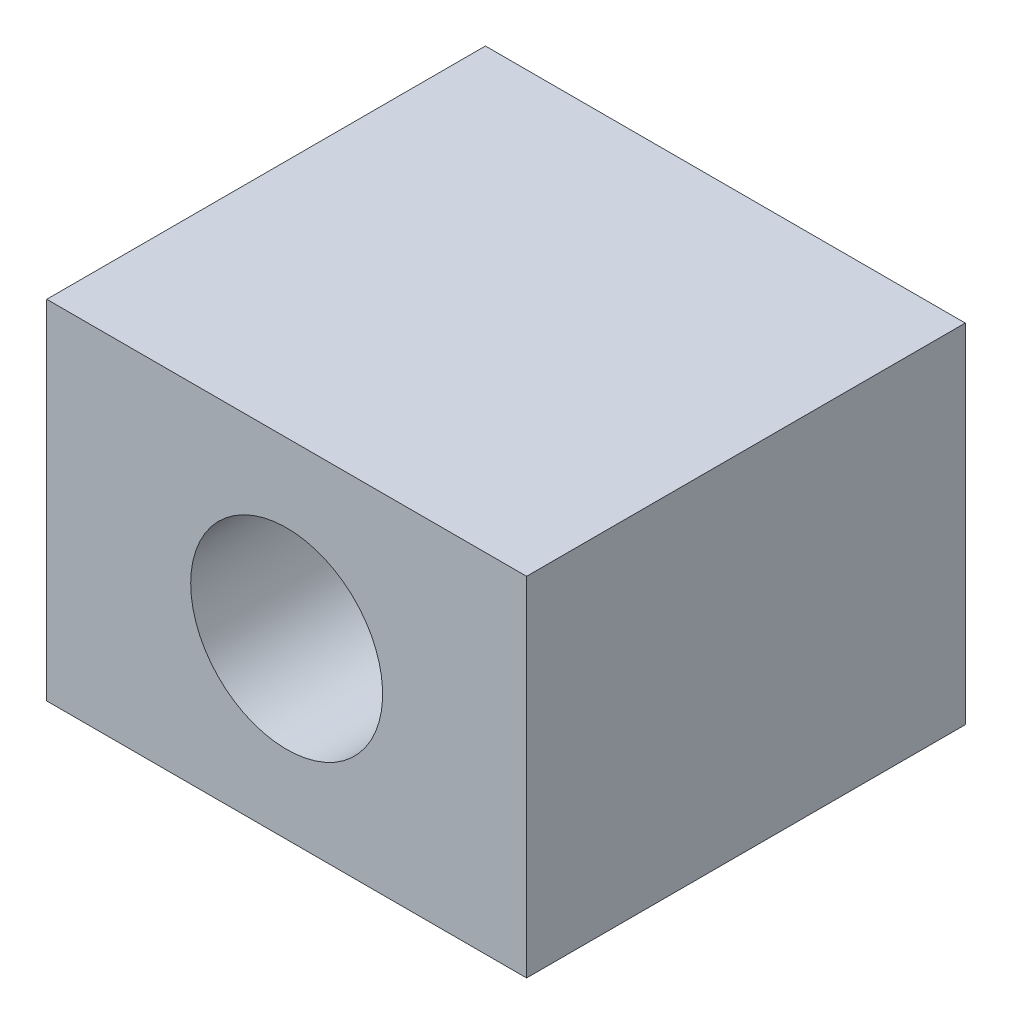
ISO-10303-21;
HEADER;
FILE_DESCRIPTION(('STEP AP214'),'2;1');
FILE_NAME('part.step','',(''),(''),'','','');
FILE_SCHEMA(('AUTOMOTIVE_DESIGN { 1 0 10303 214 1 1 1 1 }'));
ENDSEC;
DATA;
#1=APPLICATION_CONTEXT('core data for automotive mechanical design processes');
#2=APPLICATION_PROTOCOL_DEFINITION('international standard','automotive_design',2000,#1);
#3=PRODUCT_CONTEXT('',#1,'mechanical');
#4=PRODUCT('Part','Part','',(#3));
#5=PRODUCT_RELATED_PRODUCT_CATEGORY('part','',(#4));
#6=PRODUCT_DEFINITION_FORMATION('','',#4);
#7=PRODUCT_DEFINITION_CONTEXT('part definition',#1,'design');
#8=PRODUCT_DEFINITION('design','',#6,#7);
#9=PRODUCT_DEFINITION_SHAPE('','',#8);
#10=(LENGTH_UNIT() NAMED_UNIT(*) SI_UNIT(.MILLI.,.METRE.));
#11=(NAMED_UNIT(*) PLANE_ANGLE_UNIT() SI_UNIT($,.RADIAN.));
#12=(NAMED_UNIT(*) SI_UNIT($,.STERADIAN.) SOLID_ANGLE_UNIT());
#13=UNCERTAINTY_MEASURE_WITH_UNIT(LENGTH_MEASURE(1.E-05),#10,'distance_accuracy_value','');
#14=(GEOMETRIC_REPRESENTATION_CONTEXT(3) GLOBAL_UNCERTAINTY_ASSIGNED_CONTEXT((#13)) GLOBAL_UNIT_ASSIGNED_CONTEXT((#10,
#11,#12)) REPRESENTATION_CONTEXT('',''));
#15=CARTESIAN_POINT('',(0.,0.,0.));
#16=DIRECTION('',(0.,0.,1.));
#17=DIRECTION('',(1.,0.,0.));
#18=AXIS2_PLACEMENT_3D('',#15,#16,#17);
#19=CARTESIAN_POINT('',(2.,11.,-15.));
#20=DIRECTION('',(0.,1.,0.));
#21=DIRECTION('',(0.,0.,1.));
#22=AXIS2_PLACEMENT_3D('',#19,#20,#21);
#23=PLANE('',#22);
#24=DIRECTION('',(1.,0.,0.));
#25=VECTOR('',#24,1.);
#26=CARTESIAN_POINT('',(-2.,11.,-2.));
#27=LINE('',#26,#25);
#28=CARTESIAN_POINT('',(-2.,11.,-2.));
#29=VERTEX_POINT('',#28);
#30=CARTESIAN_POINT('',(2.,11.,-2.));
#31=VERTEX_POINT('',#30);
#32=EDGE_CURVE('E81',#29,#31,#27,.T.);
#33=ORIENTED_EDGE('',*,*,#32,.T.);
#34=DIRECTION('',(0.,0.,1.));
#35=VECTOR('',#34,1.);
#36=CARTESIAN_POINT('',(2.,11.,-15.));
#37=LINE('',#36,#35);
#38=CARTESIAN_POINT('',(2.,11.,-5.65685424949238));
#39=VERTEX_POINT('',#38);
#40=EDGE_CURVE('E120',#39,#31,#37,.T.);
#41=ORIENTED_EDGE('',*,*,#40,.F.);
#42=DIRECTION('',(1.,0.,0.));
#43=VECTOR('',#42,1.);
#44=CARTESIAN_POINT('',(-2.,11.,-5.65685424949238));
#45=LINE('',#44,#43);
#46=CARTESIAN_POINT('',(-2.,11.,-5.65685424949238));
#47=VERTEX_POINT('',#46);
#48=EDGE_CURVE('E138',#47,#39,#45,.T.);
#49=ORIENTED_EDGE('',*,*,#48,.F.);
#50=DIRECTION('',(0.,0.,1.));
#51=VECTOR('',#50,1.);
#52=CARTESIAN_POINT('',(-2.,11.,-15.));
#53=LINE('',#52,#51);
#54=EDGE_CURVE('E122',#47,#29,#53,.T.);
#55=ORIENTED_EDGE('',*,*,#54,.T.);
#56=EDGE_LOOP('',(#33,#41,#49,#55));
#57=FACE_BOUND('',#56,.T.);
#58=ADVANCED_FACE('F65',(#57),#23,.T.);
#59=CARTESIAN_POINT('',(-2.,8.1,-15.));
#60=DIRECTION('',(0.,-1.,0.));
#61=DIRECTION('',(0.,0.,-1.));
#62=AXIS2_PLACEMENT_3D('',#59,#60,#61);
#63=PLANE('',#62);
#64=DIRECTION('',(1.,0.,0.));
#65=VECTOR('',#64,1.);
#66=CARTESIAN_POINT('',(-2.,8.1,-2.));
#67=LINE('',#66,#65);
#68=CARTESIAN_POINT('',(-2.,8.1,-2.));
#69=VERTEX_POINT('',#68);
#70=CARTESIAN_POINT('',(2.,8.1,-2.));
#71=VERTEX_POINT('',#70);
#72=EDGE_CURVE('E108',#69,#71,#67,.T.);
#73=ORIENTED_EDGE('',*,*,#72,.F.);
#74=DIRECTION('',(0.,0.,1.));
#75=VECTOR('',#74,1.);
#76=CARTESIAN_POINT('',(-2.,8.1,-15.));
#77=LINE('',#76,#75);
#78=CARTESIAN_POINT('',(-2.,8.1,-5.65685424949238));
#79=VERTEX_POINT('',#78);
#80=EDGE_CURVE('E128',#79,#69,#77,.T.);
#81=ORIENTED_EDGE('',*,*,#80,.F.);
#82=DIRECTION('',(1.,0.,0.));
#83=VECTOR('',#82,1.);
#84=CARTESIAN_POINT('',(-2.,8.1,-5.65685424949238));
#85=LINE('',#84,#83);
#86=CARTESIAN_POINT('',(2.,8.1,-5.65685424949238));
#87=VERTEX_POINT('',#86);
#88=EDGE_CURVE('E88',#79,#87,#85,.T.);
#89=ORIENTED_EDGE('',*,*,#88,.T.);
#90=DIRECTION('',(0.,0.,1.));
#91=VECTOR('',#90,1.);
#92=CARTESIAN_POINT('',(2.,8.1,-15.));
#93=LINE('',#92,#91);
#94=EDGE_CURVE('E126',#87,#71,#93,.T.);
#95=ORIENTED_EDGE('',*,*,#94,.T.);
#96=EDGE_LOOP('',(#73,#81,#89,#95));
#97=FACE_BOUND('',#96,.T.);
#98=ADVANCED_FACE('F67',(#97),#63,.T.);
#99=CARTESIAN_POINT('',(0.,9.55,-1.5));
#100=DIRECTION('',(0.,0.,1.));
#101=DIRECTION('',(1.,0.,0.));
#102=AXIS2_PLACEMENT_3D('',#99,#100,#101);
#103=CYLINDRICAL_SURFACE('',#102,0.799999999999999);
#104=CARTESIAN_POINT('',(0.,9.55,-2.));
#105=DIRECTION('',(0.,0.,-1.));
#106=DIRECTION('',(-1.,0.,0.));
#107=AXIS2_PLACEMENT_3D('',#104,#105,#106);
#108=CIRCLE('',#107,0.799999999999999);
#109=CARTESIAN_POINT('',(-0.799999999999999,9.55,-2.));
#110=VERTEX_POINT('',#109);
#111=EDGE_CURVE('E113',#110,#110,#108,.F.);
#112=ORIENTED_EDGE('',*,*,#111,.T.);
#113=EDGE_LOOP('',(#112));
#114=FACE_BOUND('',#113,.T.);
#115=CARTESIAN_POINT('',(0.,9.55,-5.65685424949238));
#116=DIRECTION('',(0.,0.,-1.));
#117=DIRECTION('',(-1.,0.,0.));
#118=AXIS2_PLACEMENT_3D('',#115,#116,#117);
#119=CIRCLE('',#118,0.799999999999999);
#120=CARTESIAN_POINT('',(-0.799999999999999,9.55,-5.65685424949238));
#121=VERTEX_POINT('',#120);
#122=EDGE_CURVE('E69',#121,#121,#119,.F.);
#123=ORIENTED_EDGE('',*,*,#122,.F.);
#124=EDGE_LOOP('',(#123));
#125=FACE_BOUND('',#124,.T.);
#126=ADVANCED_FACE('F145',(#114,#125),#103,.F.);
#127=CARTESIAN_POINT('',(2.,8.1,-15.));
#128=DIRECTION('',(1.,0.,0.));
#129=DIRECTION('',(0.,1.,0.));
#130=AXIS2_PLACEMENT_3D('',#127,#128,#129);
#131=PLANE('',#130);
#132=DIRECTION('',(0.,-1.,0.));
#133=VECTOR('',#132,1.);
#134=CARTESIAN_POINT('',(2.,11.,-2.));
#135=LINE('',#134,#133);
#136=EDGE_CURVE('E104',#31,#71,#135,.T.);
#137=ORIENTED_EDGE('',*,*,#136,.T.);
#138=ORIENTED_EDGE('',*,*,#94,.F.);
#139=DIRECTION('',(0.,-1.,0.));
#140=VECTOR('',#139,1.);
#141=CARTESIAN_POINT('',(2.,15.,-5.65685424949238));
#142=LINE('',#141,#140);
#143=EDGE_CURVE('E74',#87,#39,#142,.F.);
#144=ORIENTED_EDGE('',*,*,#143,.T.);
#145=ORIENTED_EDGE('',*,*,#40,.T.);
#146=EDGE_LOOP('',(#137,#138,#144,#145));
#147=FACE_BOUND('',#146,.T.);
#148=ADVANCED_FACE('F125',(#147),#131,.T.);
#149=CARTESIAN_POINT('',(-2.,8.1,-15.));
#150=DIRECTION('',(1.,0.,0.));
#151=DIRECTION('',(0.,1.,0.));
#152=AXIS2_PLACEMENT_3D('',#149,#150,#151);
#153=PLANE('',#152);
#154=ORIENTED_EDGE('',*,*,#80,.T.);
#155=DIRECTION('',(0.,-1.,0.));
#156=VECTOR('',#155,1.);
#157=CARTESIAN_POINT('',(-2.,11.,-2.));
#158=LINE('',#157,#156);
#159=EDGE_CURVE('E114',#29,#69,#158,.T.);
#160=ORIENTED_EDGE('',*,*,#159,.F.);
#161=ORIENTED_EDGE('',*,*,#54,.F.);
#162=DIRECTION('',(0.,-1.,0.));
#163=VECTOR('',#162,1.);
#164=CARTESIAN_POINT('',(-2.,15.,-5.65685424949238));
#165=LINE('',#164,#163);
#166=EDGE_CURVE('E13',#79,#47,#165,.F.);
#167=ORIENTED_EDGE('',*,*,#166,.F.);
#168=EDGE_LOOP('',(#154,#160,#161,#167));
#169=FACE_BOUND('',#168,.T.);
#170=ADVANCED_FACE('F157',(#169),#153,.F.);
#171=CARTESIAN_POINT('',(-2.,11.,-5.65685424949238));
#172=DIRECTION('',(0.,0.,-1.));
#173=DIRECTION('',(-1.,0.,0.));
#174=AXIS2_PLACEMENT_3D('',#171,#172,#173);
#175=PLANE('',#174);
#176=ORIENTED_EDGE('',*,*,#88,.F.);
#177=ORIENTED_EDGE('',*,*,#166,.T.);
#178=ORIENTED_EDGE('',*,*,#48,.T.);
#179=ORIENTED_EDGE('',*,*,#143,.F.);
#180=EDGE_LOOP('',(#176,#177,#178,#179));
#181=FACE_BOUND('',#180,.T.);
#182=ORIENTED_EDGE('',*,*,#122,.T.);
#183=EDGE_LOOP('',(#182));
#184=FACE_BOUND('',#183,.T.);
#185=ADVANCED_FACE('F162',(#181,#184),#175,.T.);
#186=CARTESIAN_POINT('',(-2.,11.,-2.));
#187=DIRECTION('',(0.,0.,-1.));
#188=DIRECTION('',(-1.,0.,0.));
#189=AXIS2_PLACEMENT_3D('',#186,#187,#188);
#190=PLANE('',#189);
#191=ORIENTED_EDGE('',*,*,#72,.T.);
#192=ORIENTED_EDGE('',*,*,#136,.F.);
#193=ORIENTED_EDGE('',*,*,#32,.F.);
#194=ORIENTED_EDGE('',*,*,#159,.T.);
#195=EDGE_LOOP('',(#191,#192,#193,#194));
#196=FACE_BOUND('',#195,.T.);
#197=ORIENTED_EDGE('',*,*,#111,.F.);
#198=EDGE_LOOP('',(#197));
#199=FACE_BOUND('',#198,.T.);
#200=ADVANCED_FACE('F105',(#196,#199),#190,.F.);
#201=CLOSED_SHELL('',(#58,#98,#126,#148,#170,#185,#200));
#202=MANIFOLD_SOLID_BREP('B2',#201);
#203=ADVANCED_BREP_SHAPE_REPRESENTATION('',(#18,#202),#14);
#204=SHAPE_DEFINITION_REPRESENTATION(#9,#203);
ENDSEC;
END-ISO-10303-21;
